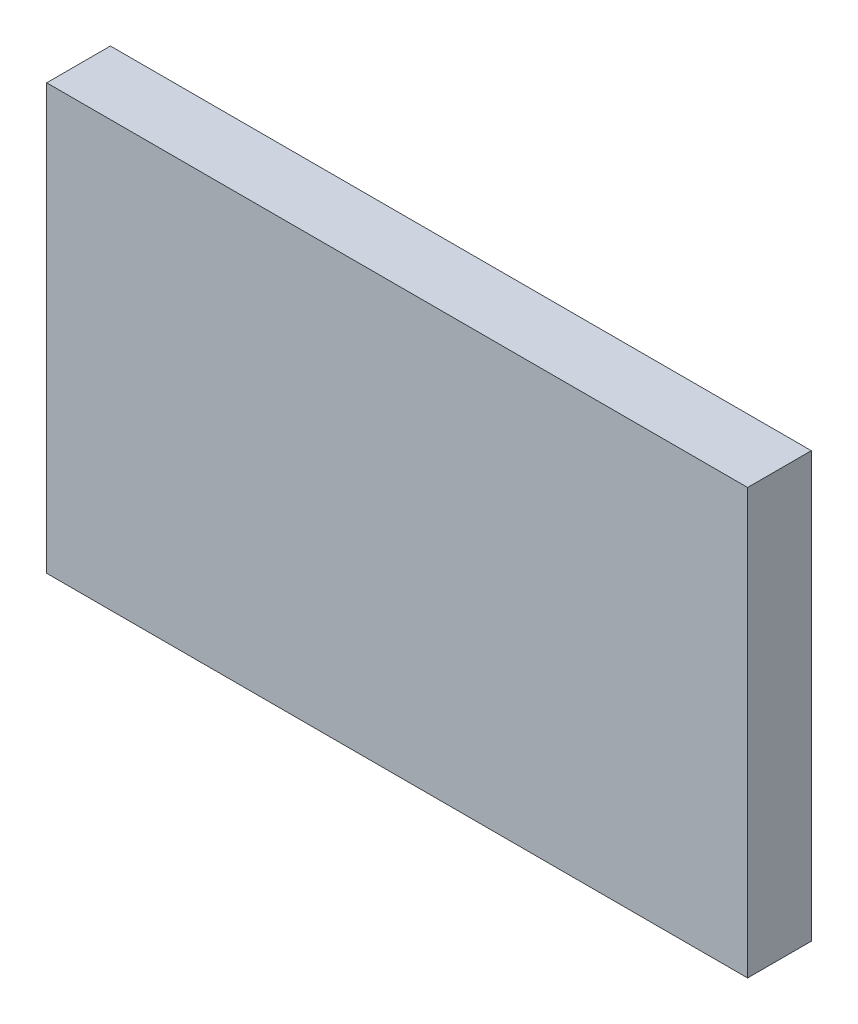
ISO-10303-21;
HEADER;
FILE_DESCRIPTION(('STEP AP214'),'2;1');
FILE_NAME('part.step','',(''),(''),'','','');
FILE_SCHEMA(('AUTOMOTIVE_DESIGN { 1 0 10303 214 1 1 1 1 }'));
ENDSEC;
DATA;
#1=APPLICATION_CONTEXT('core data for automotive mechanical design processes');
#2=APPLICATION_PROTOCOL_DEFINITION('international standard','automotive_design',2000,#1);
#3=PRODUCT_CONTEXT('',#1,'mechanical');
#4=PRODUCT('Part','Part','',(#3));
#5=PRODUCT_RELATED_PRODUCT_CATEGORY('part','',(#4));
#6=PRODUCT_DEFINITION_FORMATION('','',#4);
#7=PRODUCT_DEFINITION_CONTEXT('part definition',#1,'design');
#8=PRODUCT_DEFINITION('design','',#6,#7);
#9=PRODUCT_DEFINITION_SHAPE('','',#8);
#10=(LENGTH_UNIT() NAMED_UNIT(*) SI_UNIT(.MILLI.,.METRE.));
#11=(NAMED_UNIT(*) PLANE_ANGLE_UNIT() SI_UNIT($,.RADIAN.));
#12=(NAMED_UNIT(*) SI_UNIT($,.STERADIAN.) SOLID_ANGLE_UNIT());
#13=UNCERTAINTY_MEASURE_WITH_UNIT(LENGTH_MEASURE(1.E-05),#10,'distance_accuracy_value','');
#14=(GEOMETRIC_REPRESENTATION_CONTEXT(3) GLOBAL_UNCERTAINTY_ASSIGNED_CONTEXT((#13)) GLOBAL_UNIT_ASSIGNED_CONTEXT((#10,
#11,#12)) REPRESENTATION_CONTEXT('',''));
#15=CARTESIAN_POINT('',(0.,0.,0.));
#16=DIRECTION('',(0.,0.,1.));
#17=DIRECTION('',(1.,0.,0.));
#18=AXIS2_PLACEMENT_3D('',#15,#16,#17);
#19=CARTESIAN_POINT('',(3.65,-0.5,0.15));
#20=DIRECTION('',(0.,-1.,0.));
#21=DIRECTION('',(0.,0.,-1.));
#22=AXIS2_PLACEMENT_3D('',#19,#20,#21);
#23=PLANE('',#22);
#24=DIRECTION('',(-1.,0.,0.));
#25=VECTOR('',#24,1.);
#26=CARTESIAN_POINT('',(3.65,-0.5,0.));
#27=LINE('',#26,#25);
#28=CARTESIAN_POINT('',(3.65,-0.5,0.));
#29=VERTEX_POINT('',#28);
#30=CARTESIAN_POINT('',(2.,-0.5,0.));
#31=VERTEX_POINT('',#30);
#32=EDGE_CURVE('E67',#29,#31,#27,.T.);
#33=ORIENTED_EDGE('',*,*,#32,.F.);
#34=DIRECTION('',(0.,0.,-1.));
#35=VECTOR('',#34,1.);
#36=CARTESIAN_POINT('',(3.65,-0.5,0.15));
#37=LINE('',#36,#35);
#38=CARTESIAN_POINT('',(3.65,-0.5,0.15));
#39=VERTEX_POINT('',#38);
#40=EDGE_CURVE('E83',#39,#29,#37,.T.);
#41=ORIENTED_EDGE('',*,*,#40,.F.);
#42=DIRECTION('',(-1.,0.,0.));
#43=VECTOR('',#42,1.);
#44=CARTESIAN_POINT('',(3.65,-0.5,0.15));
#45=LINE('',#44,#43);
#46=CARTESIAN_POINT('',(2.,-0.5,0.15));
#47=VERTEX_POINT('',#46);
#48=EDGE_CURVE('E69',#39,#47,#45,.T.);
#49=ORIENTED_EDGE('',*,*,#48,.T.);
#50=DIRECTION('',(0.,0.,-1.));
#51=VECTOR('',#50,1.);
#52=CARTESIAN_POINT('',(2.,-0.5,0.15));
#53=LINE('',#52,#51);
#54=EDGE_CURVE('E11',#47,#31,#53,.T.);
#55=ORIENTED_EDGE('',*,*,#54,.T.);
#56=EDGE_LOOP('',(#33,#41,#49,#55));
#57=FACE_BOUND('',#56,.T.);
#58=ADVANCED_FACE('F17',(#57),#23,.T.);
#59=CARTESIAN_POINT('',(2.,-0.5,0.15));
#60=DIRECTION('',(-1.,0.,0.));
#61=DIRECTION('',(0.,0.,1.));
#62=AXIS2_PLACEMENT_3D('',#59,#60,#61);
#63=PLANE('',#62);
#64=DIRECTION('',(0.,1.,0.));
#65=VECTOR('',#64,1.);
#66=CARTESIAN_POINT('',(2.,-0.5,0.));
#67=LINE('',#66,#65);
#68=CARTESIAN_POINT('',(2.,0.5,0.));
#69=VERTEX_POINT('',#68);
#70=EDGE_CURVE('E72',#31,#69,#67,.T.);
#71=ORIENTED_EDGE('',*,*,#70,.F.);
#72=ORIENTED_EDGE('',*,*,#54,.F.);
#73=DIRECTION('',(0.,1.,0.));
#74=VECTOR('',#73,1.);
#75=CARTESIAN_POINT('',(2.,-0.5,0.15));
#76=LINE('',#75,#74);
#77=CARTESIAN_POINT('',(2.,0.5,0.15));
#78=VERTEX_POINT('',#77);
#79=EDGE_CURVE('E97',#47,#78,#76,.T.);
#80=ORIENTED_EDGE('',*,*,#79,.T.);
#81=DIRECTION('',(0.,0.,-1.));
#82=VECTOR('',#81,1.);
#83=CARTESIAN_POINT('',(2.,0.5,0.15));
#84=LINE('',#83,#82);
#85=EDGE_CURVE('E28',#78,#69,#84,.T.);
#86=ORIENTED_EDGE('',*,*,#85,.T.);
#87=EDGE_LOOP('',(#71,#72,#80,#86));
#88=FACE_BOUND('',#87,.T.);
#89=ADVANCED_FACE('F19',(#88),#63,.T.);
#90=CARTESIAN_POINT('',(2.,0.5,0.15));
#91=DIRECTION('',(0.,1.,0.));
#92=DIRECTION('',(1.,0.,0.));
#93=AXIS2_PLACEMENT_3D('',#90,#91,#92);
#94=PLANE('',#93);
#95=DIRECTION('',(1.,0.,0.));
#96=VECTOR('',#95,1.);
#97=CARTESIAN_POINT('',(2.,0.5,0.));
#98=LINE('',#97,#96);
#99=CARTESIAN_POINT('',(3.65,0.5,0.));
#100=VERTEX_POINT('',#99);
#101=EDGE_CURVE('E76',#69,#100,#98,.T.);
#102=ORIENTED_EDGE('',*,*,#101,.F.);
#103=ORIENTED_EDGE('',*,*,#85,.F.);
#104=DIRECTION('',(1.,0.,0.));
#105=VECTOR('',#104,1.);
#106=CARTESIAN_POINT('',(2.,0.5,0.15));
#107=LINE('',#106,#105);
#108=CARTESIAN_POINT('',(3.65,0.5,0.15));
#109=VERTEX_POINT('',#108);
#110=EDGE_CURVE('E100',#78,#109,#107,.T.);
#111=ORIENTED_EDGE('',*,*,#110,.T.);
#112=DIRECTION('',(0.,0.,-1.));
#113=VECTOR('',#112,1.);
#114=CARTESIAN_POINT('',(3.65,0.5,0.15));
#115=LINE('',#114,#113);
#116=EDGE_CURVE('E92',#109,#100,#115,.T.);
#117=ORIENTED_EDGE('',*,*,#116,.T.);
#118=EDGE_LOOP('',(#102,#103,#111,#117));
#119=FACE_BOUND('',#118,.T.);
#120=ADVANCED_FACE('F113',(#119),#94,.T.);
#121=CARTESIAN_POINT('',(3.65,-0.5,0.15));
#122=DIRECTION('',(0.,0.,-1.));
#123=DIRECTION('',(0.,-1.,0.));
#124=AXIS2_PLACEMENT_3D('',#121,#122,#123);
#125=PLANE('',#124);
#126=DIRECTION('',(0.,-1.,0.));
#127=VECTOR('',#126,1.);
#128=CARTESIAN_POINT('',(3.65,0.5,0.15));
#129=LINE('',#128,#127);
#130=EDGE_CURVE('E21',#109,#39,#129,.T.);
#131=ORIENTED_EDGE('',*,*,#130,.F.);
#132=ORIENTED_EDGE('',*,*,#110,.F.);
#133=ORIENTED_EDGE('',*,*,#79,.F.);
#134=ORIENTED_EDGE('',*,*,#48,.F.);
#135=EDGE_LOOP('',(#131,#132,#133,#134));
#136=FACE_BOUND('',#135,.T.);
#137=ADVANCED_FACE('F135',(#136),#125,.F.);
#138=CARTESIAN_POINT('',(3.65,-0.5,0.));
#139=DIRECTION('',(0.,0.,-1.));
#140=DIRECTION('',(0.,-1.,0.));
#141=AXIS2_PLACEMENT_3D('',#138,#139,#140);
#142=PLANE('',#141);
#143=DIRECTION('',(0.,-1.,0.));
#144=VECTOR('',#143,1.);
#145=CARTESIAN_POINT('',(3.65,0.5,0.));
#146=LINE('',#145,#144);
#147=EDGE_CURVE('E81',#100,#29,#146,.T.);
#148=ORIENTED_EDGE('',*,*,#147,.T.);
#149=ORIENTED_EDGE('',*,*,#32,.T.);
#150=ORIENTED_EDGE('',*,*,#70,.T.);
#151=ORIENTED_EDGE('',*,*,#101,.T.);
#152=EDGE_LOOP('',(#148,#149,#150,#151));
#153=FACE_BOUND('',#152,.T.);
#154=ADVANCED_FACE('F79',(#153),#142,.T.);
#155=CARTESIAN_POINT('',(3.65,0.5,0.15));
#156=DIRECTION('',(1.,0.,0.));
#157=DIRECTION('',(0.,1.,0.));
#158=AXIS2_PLACEMENT_3D('',#155,#156,#157);
#159=PLANE('',#158);
#160=ORIENTED_EDGE('',*,*,#147,.F.);
#161=ORIENTED_EDGE('',*,*,#116,.F.);
#162=ORIENTED_EDGE('',*,*,#130,.T.);
#163=ORIENTED_EDGE('',*,*,#40,.T.);
#164=EDGE_LOOP('',(#160,#161,#162,#163));
#165=FACE_BOUND('',#164,.T.);
#166=ADVANCED_FACE('F116',(#165),#159,.T.);
#167=CLOSED_SHELL('',(#58,#89,#120,#137,#154,#166));
#168=MANIFOLD_SOLID_BREP('B1',#167);
#169=ADVANCED_BREP_SHAPE_REPRESENTATION('',(#18,#168),#14);
#170=SHAPE_DEFINITION_REPRESENTATION(#9,#169);
ENDSEC;
END-ISO-10303-21;
